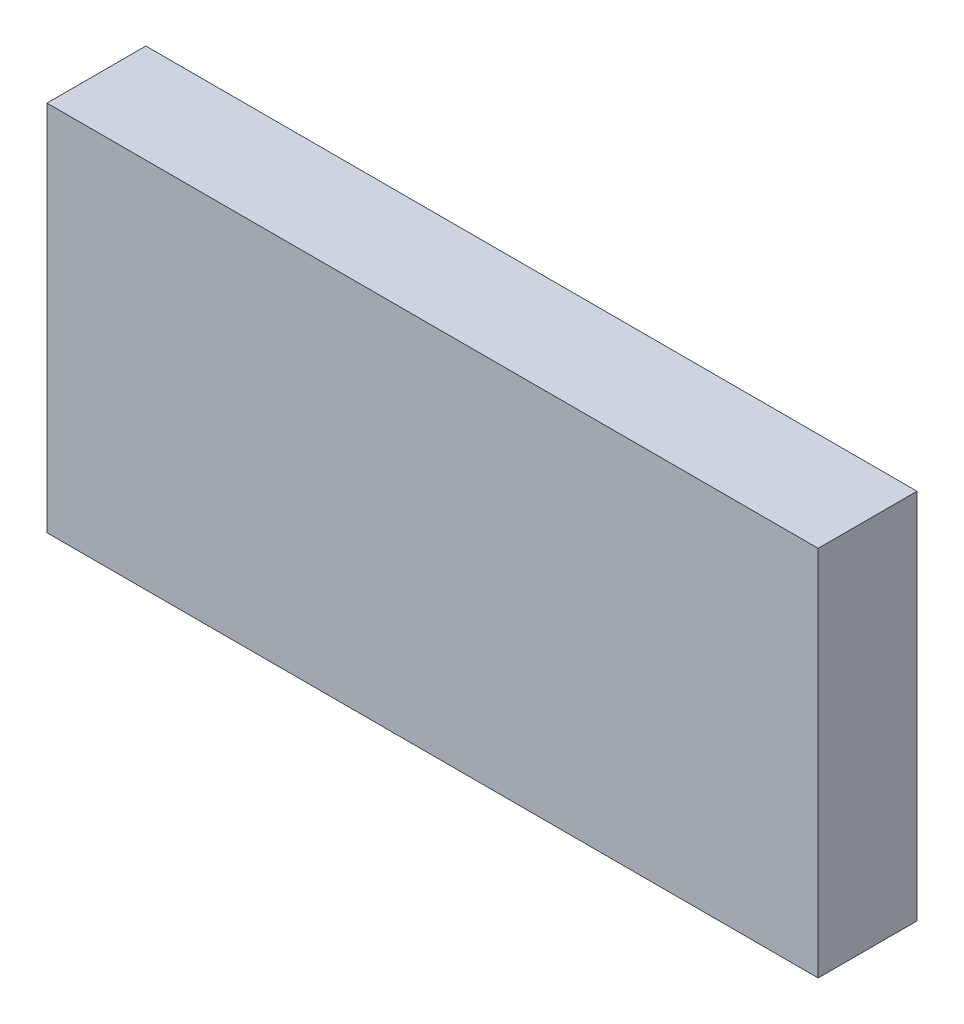
ISO-10303-21;
HEADER;
FILE_DESCRIPTION(('STEP AP214'),'2;1');
FILE_NAME('part.step','',(''),(''),'','','');
FILE_SCHEMA(('AUTOMOTIVE_DESIGN { 1 0 10303 214 1 1 1 1 }'));
ENDSEC;
DATA;
#1=APPLICATION_CONTEXT('core data for automotive mechanical design processes');
#2=APPLICATION_PROTOCOL_DEFINITION('international standard','automotive_design',2000,#1);
#3=PRODUCT_CONTEXT('',#1,'mechanical');
#4=PRODUCT('Part','Part','',(#3));
#5=PRODUCT_RELATED_PRODUCT_CATEGORY('part','',(#4));
#6=PRODUCT_DEFINITION_FORMATION('','',#4);
#7=PRODUCT_DEFINITION_CONTEXT('part definition',#1,'design');
#8=PRODUCT_DEFINITION('design','',#6,#7);
#9=PRODUCT_DEFINITION_SHAPE('','',#8);
#10=(LENGTH_UNIT() NAMED_UNIT(*) SI_UNIT(.MILLI.,.METRE.));
#11=(NAMED_UNIT(*) PLANE_ANGLE_UNIT() SI_UNIT($,.RADIAN.));
#12=(NAMED_UNIT(*) SI_UNIT($,.STERADIAN.) SOLID_ANGLE_UNIT());
#13=UNCERTAINTY_MEASURE_WITH_UNIT(LENGTH_MEASURE(1.E-05),#10,'distance_accuracy_value','');
#14=(GEOMETRIC_REPRESENTATION_CONTEXT(3) GLOBAL_UNCERTAINTY_ASSIGNED_CONTEXT((#13)) GLOBAL_UNIT_ASSIGNED_CONTEXT((#10,
#11,#12)) REPRESENTATION_CONTEXT('',''));
#15=CARTESIAN_POINT('',(0.,0.,0.));
#16=DIRECTION('',(0.,0.,1.));
#17=DIRECTION('',(1.,0.,0.));
#18=AXIS2_PLACEMENT_3D('',#15,#16,#17);
#19=CARTESIAN_POINT('',(-3.9,2.1635,1.));
#20=DIRECTION('',(0.,0.,1.));
#21=DIRECTION('',(1.,0.,0.));
#22=AXIS2_PLACEMENT_3D('',#19,#20,#21);
#23=PLANE('',#22);
#24=DIRECTION('',(0.,1.,0.));
#25=VECTOR('',#24,1.);
#26=CARTESIAN_POINT('',(3.9,2.1635,1.));
#27=LINE('',#26,#25);
#28=CARTESIAN_POINT('',(3.9,2.1635,1.));
#29=VERTEX_POINT('',#28);
#30=CARTESIAN_POINT('',(3.9,-1.6,1.));
#31=VERTEX_POINT('',#30);
#32=EDGE_CURVE('E53',#29,#31,#27,.F.);
#33=ORIENTED_EDGE('',*,*,#32,.F.);
#34=DIRECTION('',(1.,0.,0.));
#35=VECTOR('',#34,1.);
#36=CARTESIAN_POINT('',(-3.9,2.1635,1.));
#37=LINE('',#36,#35);
#38=CARTESIAN_POINT('',(-3.9,2.1635,1.));
#39=VERTEX_POINT('',#38);
#40=EDGE_CURVE('E68',#39,#29,#37,.T.);
#41=ORIENTED_EDGE('',*,*,#40,.F.);
#42=DIRECTION('',(0.,1.,0.));
#43=VECTOR('',#42,1.);
#44=CARTESIAN_POINT('',(-3.9,-1.6,1.));
#45=LINE('',#44,#43);
#46=CARTESIAN_POINT('',(-3.9,-1.6,1.));
#47=VERTEX_POINT('',#46);
#48=EDGE_CURVE('E20',#47,#39,#45,.T.);
#49=ORIENTED_EDGE('',*,*,#48,.F.);
#50=DIRECTION('',(1.,0.,0.));
#51=VECTOR('',#50,1.);
#52=CARTESIAN_POINT('',(3.9,-1.6,1.));
#53=LINE('',#52,#51);
#54=EDGE_CURVE('E58',#31,#47,#53,.F.);
#55=ORIENTED_EDGE('',*,*,#54,.F.);
#56=EDGE_LOOP('',(#33,#41,#49,#55));
#57=FACE_BOUND('',#56,.T.);
#58=ADVANCED_FACE('F17',(#57),#23,.T.);
#59=CARTESIAN_POINT('',(-3.9,-1.6,0.));
#60=DIRECTION('',(-1.,0.,0.));
#61=DIRECTION('',(0.,0.,1.));
#62=AXIS2_PLACEMENT_3D('',#59,#60,#61);
#63=PLANE('',#62);
#64=DIRECTION('',(0.,0.,1.));
#65=VECTOR('',#64,1.);
#66=CARTESIAN_POINT('',(-3.9,2.1635,0.));
#67=LINE('',#66,#65);
#68=CARTESIAN_POINT('',(-3.9,2.1635,0.));
#69=VERTEX_POINT('',#68);
#70=EDGE_CURVE('E79',#69,#39,#67,.T.);
#71=ORIENTED_EDGE('',*,*,#70,.F.);
#72=DIRECTION('',(0.,1.,0.));
#73=VECTOR('',#72,1.);
#74=CARTESIAN_POINT('',(-3.9,2.1635,0.));
#75=LINE('',#74,#73);
#76=CARTESIAN_POINT('',(-3.9,-1.6,0.));
#77=VERTEX_POINT('',#76);
#78=EDGE_CURVE('E74',#69,#77,#75,.F.);
#79=ORIENTED_EDGE('',*,*,#78,.T.);
#80=DIRECTION('',(0.,0.,-1.));
#81=VECTOR('',#80,1.);
#82=CARTESIAN_POINT('',(-3.9,-1.6,0.));
#83=LINE('',#82,#81);
#84=EDGE_CURVE('E63',#47,#77,#83,.T.);
#85=ORIENTED_EDGE('',*,*,#84,.F.);
#86=ORIENTED_EDGE('',*,*,#48,.T.);
#87=EDGE_LOOP('',(#71,#79,#85,#86));
#88=FACE_BOUND('',#87,.T.);
#89=ADVANCED_FACE('F73',(#88),#63,.T.);
#90=CARTESIAN_POINT('',(3.9,-1.6,0.));
#91=DIRECTION('',(0.,-1.,0.));
#92=DIRECTION('',(0.,0.,-1.));
#93=AXIS2_PLACEMENT_3D('',#90,#91,#92);
#94=PLANE('',#93);
#95=ORIENTED_EDGE('',*,*,#84,.T.);
#96=DIRECTION('',(1.,0.,0.));
#97=VECTOR('',#96,1.);
#98=CARTESIAN_POINT('',(-3.9,-1.6,0.));
#99=LINE('',#98,#97);
#100=CARTESIAN_POINT('',(3.9,-1.6,0.));
#101=VERTEX_POINT('',#100);
#102=EDGE_CURVE('E84',#77,#101,#99,.T.);
#103=ORIENTED_EDGE('',*,*,#102,.T.);
#104=DIRECTION('',(0.,0.,-1.));
#105=VECTOR('',#104,1.);
#106=CARTESIAN_POINT('',(3.9,-1.6,0.));
#107=LINE('',#106,#105);
#108=EDGE_CURVE('E65',#31,#101,#107,.T.);
#109=ORIENTED_EDGE('',*,*,#108,.F.);
#110=ORIENTED_EDGE('',*,*,#54,.T.);
#111=EDGE_LOOP('',(#95,#103,#109,#110));
#112=FACE_BOUND('',#111,.T.);
#113=ADVANCED_FACE('F60',(#112),#94,.T.);
#114=CARTESIAN_POINT('',(3.9,2.1635,0.));
#115=DIRECTION('',(1.,0.,0.));
#116=DIRECTION('',(0.,0.,-1.));
#117=AXIS2_PLACEMENT_3D('',#114,#115,#116);
#118=PLANE('',#117);
#119=ORIENTED_EDGE('',*,*,#108,.T.);
#120=DIRECTION('',(0.,1.,0.));
#121=VECTOR('',#120,1.);
#122=CARTESIAN_POINT('',(3.9,2.1635,0.));
#123=LINE('',#122,#121);
#124=CARTESIAN_POINT('',(3.9,2.1635,0.));
#125=VERTEX_POINT('',#124);
#126=EDGE_CURVE('E26',#101,#125,#123,.T.);
#127=ORIENTED_EDGE('',*,*,#126,.T.);
#128=DIRECTION('',(0.,0.,1.));
#129=VECTOR('',#128,1.);
#130=CARTESIAN_POINT('',(3.9,2.1635,0.));
#131=LINE('',#130,#129);
#132=EDGE_CURVE('E34',#29,#125,#131,.F.);
#133=ORIENTED_EDGE('',*,*,#132,.F.);
#134=ORIENTED_EDGE('',*,*,#32,.T.);
#135=EDGE_LOOP('',(#119,#127,#133,#134));
#136=FACE_BOUND('',#135,.T.);
#137=ADVANCED_FACE('F88',(#136),#118,.T.);
#138=CARTESIAN_POINT('',(-3.9,2.1635,0.));
#139=DIRECTION('',(0.,1.,0.));
#140=DIRECTION('',(0.,0.,1.));
#141=AXIS2_PLACEMENT_3D('',#138,#139,#140);
#142=PLANE('',#141);
#143=ORIENTED_EDGE('',*,*,#132,.T.);
#144=DIRECTION('',(1.,0.,0.));
#145=VECTOR('',#144,1.);
#146=CARTESIAN_POINT('',(-3.9,2.1635,0.));
#147=LINE('',#146,#145);
#148=EDGE_CURVE('E11',#125,#69,#147,.F.);
#149=ORIENTED_EDGE('',*,*,#148,.T.);
#150=ORIENTED_EDGE('',*,*,#70,.T.);
#151=ORIENTED_EDGE('',*,*,#40,.T.);
#152=EDGE_LOOP('',(#143,#149,#150,#151));
#153=FACE_BOUND('',#152,.T.);
#154=ADVANCED_FACE('F91',(#153),#142,.T.);
#155=CARTESIAN_POINT('',(-3.9,2.1635,0.));
#156=DIRECTION('',(0.,0.,1.));
#157=DIRECTION('',(1.,0.,0.));
#158=AXIS2_PLACEMENT_3D('',#155,#156,#157);
#159=PLANE('',#158);
#160=ORIENTED_EDGE('',*,*,#126,.F.);
#161=ORIENTED_EDGE('',*,*,#102,.F.);
#162=ORIENTED_EDGE('',*,*,#78,.F.);
#163=ORIENTED_EDGE('',*,*,#148,.F.);
#164=EDGE_LOOP('',(#160,#161,#162,#163));
#165=FACE_BOUND('',#164,.T.);
#166=ADVANCED_FACE('F90',(#165),#159,.F.);
#167=CLOSED_SHELL('',(#58,#89,#113,#137,#154,#166));
#168=MANIFOLD_SOLID_BREP('B1',#167);
#169=ADVANCED_BREP_SHAPE_REPRESENTATION('',(#18,#168),#14);
#170=SHAPE_DEFINITION_REPRESENTATION(#9,#169);
ENDSEC;
END-ISO-10303-21;
